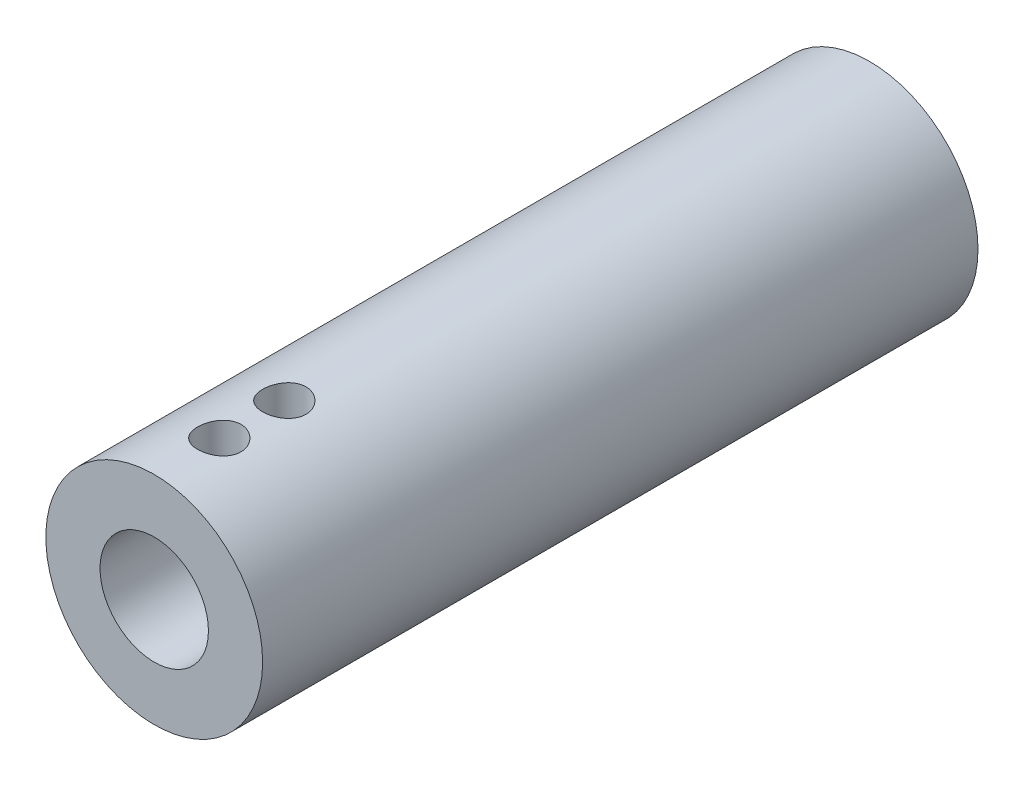
ISO-10303-21;
HEADER;
FILE_DESCRIPTION(('STEP AP214'),'2;1');
FILE_NAME('part.step','',(''),(''),'','','');
FILE_SCHEMA(('AUTOMOTIVE_DESIGN { 1 0 10303 214 1 1 1 1 }'));
ENDSEC;
DATA;
#1=APPLICATION_CONTEXT('core data for automotive mechanical design processes');
#2=APPLICATION_PROTOCOL_DEFINITION('international standard','automotive_design',2000,#1);
#3=PRODUCT_CONTEXT('',#1,'mechanical');
#4=PRODUCT('Part','Part','',(#3));
#5=PRODUCT_RELATED_PRODUCT_CATEGORY('part','',(#4));
#6=PRODUCT_DEFINITION_FORMATION('','',#4);
#7=PRODUCT_DEFINITION_CONTEXT('part definition',#1,'design');
#8=PRODUCT_DEFINITION('design','',#6,#7);
#9=PRODUCT_DEFINITION_SHAPE('','',#8);
#10=(LENGTH_UNIT() NAMED_UNIT(*) SI_UNIT(.MILLI.,.METRE.));
#11=(NAMED_UNIT(*) PLANE_ANGLE_UNIT() SI_UNIT($,.RADIAN.));
#12=(NAMED_UNIT(*) SI_UNIT($,.STERADIAN.) SOLID_ANGLE_UNIT());
#13=UNCERTAINTY_MEASURE_WITH_UNIT(LENGTH_MEASURE(1.E-05),#10,'distance_accuracy_value','');
#14=(GEOMETRIC_REPRESENTATION_CONTEXT(3) GLOBAL_UNCERTAINTY_ASSIGNED_CONTEXT((#13)) GLOBAL_UNIT_ASSIGNED_CONTEXT((#10,
#11,#12)) REPRESENTATION_CONTEXT('',''));
#15=CARTESIAN_POINT('',(0.,0.,0.));
#16=DIRECTION('',(0.,0.,1.));
#17=DIRECTION('',(1.,0.,0.));
#18=AXIS2_PLACEMENT_3D('',#15,#16,#17);
#19=CARTESIAN_POINT('',(0.,0.,33.));
#20=DIRECTION('',(0.,0.,-1.));
#21=DIRECTION('',(-1.,0.,0.));
#22=AXIS2_PLACEMENT_3D('',#19,#20,#21);
#23=CYLINDRICAL_SURFACE('',#22,5.);
#24=CARTESIAN_POINT('',(0.,0.,33.));
#25=DIRECTION('',(0.,0.,1.));
#26=DIRECTION('',(1.,0.,0.));
#27=AXIS2_PLACEMENT_3D('',#24,#25,#26);
#28=CIRCLE('',#27,5.);
#29=CARTESIAN_POINT('',(5.,0.,33.));
#30=VERTEX_POINT('',#29);
#31=EDGE_CURVE('E10',#30,#30,#28,.T.);
#32=ORIENTED_EDGE('',*,*,#31,.F.);
#33=EDGE_LOOP('',(#32));
#34=FACE_BOUND('',#33,.T.);
#35=CARTESIAN_POINT('',(0.,0.,0.));
#36=DIRECTION('',(0.,0.,1.));
#37=DIRECTION('',(1.,0.,0.));
#38=AXIS2_PLACEMENT_3D('',#35,#36,#37);
#39=CIRCLE('',#38,5.);
#40=CARTESIAN_POINT('',(5.,0.,0.));
#41=VERTEX_POINT('',#40);
#42=EDGE_CURVE('E51',#41,#41,#39,.T.);
#43=ORIENTED_EDGE('',*,*,#42,.T.);
#44=EDGE_LOOP('',(#43));
#45=FACE_BOUND('',#44,.T.);
#46=CARTESIAN_POINT('',(0.,5.,26.));
#47=CARTESIAN_POINT('',(-0.0555769067926259,4.99999897580871,26.0000020444983));
#48=CARTESIAN_POINT('',(-0.111179660201515,4.99906385178231,26.0046488429676));
#49=CARTESIAN_POINT('',(-0.220813507689012,4.99542365623231,26.0230985001152));
#50=CARTESIAN_POINT('',(-0.274843317541349,4.99271717860186,26.0369086328015));
#51=CARTESIAN_POINT('',(-0.379730305263306,4.98583649278287,26.0732412736208));
#52=CARTESIAN_POINT('',(-0.430590467933128,4.98166369076718,26.0957554368447));
#53=CARTESIAN_POINT('',(-0.527807988864219,4.97230398035314,26.1488322475113));
#54=CARTESIAN_POINT('',(-0.574165615075805,4.96711713235707,26.1793944156072));
#55=CARTESIAN_POINT('',(-0.661693477314859,4.9562216532997,26.2481384942914));
#56=CARTESIAN_POINT('',(-0.702793951158519,4.95050745504347,26.2864083553912));
#57=CARTESIAN_POINT('',(-0.778036756608022,4.93924180452588,26.3692924163917));
#58=CARTESIAN_POINT('',(-0.812178544770418,4.93369036500424,26.4139071113351));
#59=CARTESIAN_POINT('',(-0.872831753347614,4.92332441812615,26.5087161930119));
#60=CARTESIAN_POINT('',(-0.899270938865861,4.91851707364946,26.5589576437964));
#61=CARTESIAN_POINT('',(-0.943305666580302,4.91026268058418,26.6632818190041));
#62=CARTESIAN_POINT('',(-0.960902082437231,4.90681549761962,26.7173641633463));
#63=CARTESIAN_POINT('',(-0.98652529988482,4.90172805252205,26.8270843639079));
#64=CARTESIAN_POINT('',(-0.99467449795877,4.90006470107188,26.8826925441422));
#65=CARTESIAN_POINT('',(-1.00155212772611,4.89866375060627,26.9945098213643));
#66=CARTESIAN_POINT('',(-1.00028152271349,4.89892595467841,27.0507188563202));
#67=CARTESIAN_POINT('',(-0.988454573101811,4.90132551148185,27.161246788021));
#68=CARTESIAN_POINT('',(-0.978038540243898,4.90343452858764,27.2155814056273));
#69=CARTESIAN_POINT('',(-0.948437884623044,4.90924546160001,27.321716076663));
#70=CARTESIAN_POINT('',(-0.929252843100675,4.91294745357779,27.373516008919));
#71=CARTESIAN_POINT('',(-0.882524783674714,4.92155618500408,27.4735152617036));
#72=CARTESIAN_POINT('',(-0.854926151232108,4.92647089813705,27.5216878795692));
#73=CARTESIAN_POINT('',(-0.792193574572671,4.93694618773062,27.6127708499728));
#74=CARTESIAN_POINT('',(-0.75705876435682,4.94250683838366,27.6556805968512));
#75=CARTESIAN_POINT('',(-0.679499934560575,4.95377021241462,27.7358294024569));
#76=CARTESIAN_POINT('',(-0.636956161212436,4.95947369210905,27.7729525678591));
#77=CARTESIAN_POINT('',(-0.546185024062001,4.97028848714409,27.8395538463012));
#78=CARTESIAN_POINT('',(-0.497957587379379,4.97539979488974,27.8690318612936));
#79=CARTESIAN_POINT('',(-0.397059386878911,4.98446690160887,27.919527509226));
#80=CARTESIAN_POINT('',(-0.34438181958529,4.98842088848272,27.9405318936445));
#81=CARTESIAN_POINT('',(-0.236148976448656,4.99471408987858,27.9733604740386));
#82=CARTESIAN_POINT('',(-0.180594050072441,4.99705350000531,27.9851857820736));
#83=CARTESIAN_POINT('',(-0.0691794056271419,4.99982671866868,27.9991564537943));
#84=CARTESIAN_POINT('',(-0.0133403283255677,5.0002917465247,28.0014604195403));
#85=CARTESIAN_POINT('',(0.0979249341927224,4.99935051930103,27.9967501410578));
#86=CARTESIAN_POINT('',(0.153351142443801,4.99794436941446,27.9897364206474));
#87=CARTESIAN_POINT('',(0.261705659946549,4.99343832008018,27.966721626456));
#88=CARTESIAN_POINT('',(0.314651948339911,4.99035376404206,27.9508019315021));
#89=CARTESIAN_POINT('',(0.417123627499674,4.98283552061033,27.9105160173442));
#90=CARTESIAN_POINT('',(0.466648761637547,4.97840173214227,27.8861491653232));
#91=CARTESIAN_POINT('',(0.561541173686224,4.96859911533294,27.8293175093487));
#92=CARTESIAN_POINT('',(0.606850126752194,4.96321950437052,27.7967572189611));
#93=CARTESIAN_POINT('',(0.691418019119213,4.95214734829882,27.7245908087927));
#94=CARTESIAN_POINT('',(0.730676308930769,4.94645476968388,27.6849839336001));
#95=CARTESIAN_POINT('',(0.802640590774184,4.93529303556965,27.5991266481089));
#96=CARTESIAN_POINT('',(0.835237702448663,4.92982860233304,27.5527842557787));
#97=CARTESIAN_POINT('',(0.892185420051214,4.91984191796194,27.4551886386433));
#98=CARTESIAN_POINT('',(0.916536355922911,4.91531962913342,27.4039356104265));
#99=CARTESIAN_POINT('',(0.956151841581969,4.90776740584383,27.2982317538505));
#100=CARTESIAN_POINT('',(0.971463499791059,4.90472974872186,27.2437991587897));
#101=CARTESIAN_POINT('',(0.992708651627204,4.90047436792025,27.1330665465091));
#102=CARTESIAN_POINT('',(0.998643368225121,4.89925640691111,27.0767667737907));
#103=CARTESIAN_POINT('',(1.00092091086748,4.89879149631379,26.9649911354557));
#104=CARTESIAN_POINT('',(0.997435788070903,4.89950919189301,26.909518851073));
#105=CARTESIAN_POINT('',(0.981352304100067,4.90275573484614,26.799968350095));
#106=CARTESIAN_POINT('',(0.968754016129305,4.90528456767169,26.7458901223052));
#107=CARTESIAN_POINT('',(0.934878568498961,4.91185264219158,26.6407722887595));
#108=CARTESIAN_POINT('',(0.91362250671735,4.9158882101883,26.5897256394976));
#109=CARTESIAN_POINT('',(0.863054644601609,4.9250171497417,26.4918962792656));
#110=CARTESIAN_POINT('',(0.833742168774888,4.93011060998894,26.4451139262749));
#111=CARTESIAN_POINT('',(0.767305914786421,4.94088960523225,26.3562844278497));
#112=CARTESIAN_POINT('',(0.730057887235187,4.94658372909699,26.3143312347324));
#113=CARTESIAN_POINT('',(0.649064369013148,4.95786081871955,26.2372137944708));
#114=CARTESIAN_POINT('',(0.605317387153343,4.96344375863184,26.2020511096827));
#115=CARTESIAN_POINT('',(0.512017629088256,4.97393832387971,26.1391653560536));
#116=CARTESIAN_POINT('',(0.462408884429844,4.97884231219246,26.11152399672));
#117=CARTESIAN_POINT('',(0.35916636094074,4.98735125085,26.0650138774034));
#118=CARTESIAN_POINT('',(0.305536260863133,4.99095737138616,26.0461372104675));
#119=CARTESIAN_POINT('',(0.209821488923786,4.99576372595371,26.0213480519553));
#120=CARTESIAN_POINT('',(0.168281664013792,4.99734303158452,26.0133568062922));
#121=CARTESIAN_POINT('',(0.0844995252100748,4.99946154139893,26.0026820876416));
#122=CARTESIAN_POINT('',(0.0422572337486266,5.00000077873155,25.9999984454902));
#123=CARTESIAN_POINT('',(0.,5.,26.));
#124=B_SPLINE_CURVE_WITH_KNOTS('',3,(#46,#47,#48,#49,#50,#51,#52,#53,#54,#55,#56,#57,#58,#59,
#60,#61,#62,#63,#64,#65,#66,#67,#68,#69,#70,#71,#72,#73,#74,#75,#76,#77,#78,#79,#80,#81,#82,#83,
#84,#85,#86,#87,#88,#89,#90,#91,#92,#93,#94,#95,#96,#97,#98,#99,#100,#101,#102,#103,#104,#105,
#106,#107,#108,#109,#110,#111,#112,#113,#114,#115,#116,#117,#118,#119,#120,#121,#122,#123),
.UNSPECIFIED.,.T.,.F.,(4,2,2,2,2,2,2,2,2,2,2,2,2,2,2,2,2,2,2,2,2,2,2,2,2,2,2,2,2,2,2,2,2,2,2,2,
2,2,4),(0.,0.166576130661259,0.333284650691323,0.499833735250342,0.666372902230865,
0.834932670112188,1.00350559674737,1.17361195005923,1.34370149365198,1.51156185103587,
1.67940504281225,1.84471727006278,2.0100373925373,2.17647490203592,2.34293154749671,
2.51238252491351,2.68183567539821,2.85155274854024,3.02124925698036,3.18810735676265,
3.35495607657868,3.52030453950724,3.68566539216022,3.85305066033359,4.0204538834593,
4.19040628579226,4.36035188723467,4.52940381032724,4.69843368330415,4.86439722567702,
5.03035943492609,5.19591961253111,5.36149367581867,5.52988076239143,5.6983065453293,
5.86849496675637,6.03852955517519,6.16518775289894,6.29184191370996),.UNSPECIFIED.);
#125=CARTESIAN_POINT('',(0.,5.,26.));
#126=VERTEX_POINT('',#125);
#127=EDGE_CURVE('E69',#126,#126,#124,.T.);
#128=ORIENTED_EDGE('',*,*,#127,.F.);
#129=EDGE_LOOP('',(#128));
#130=FACE_BOUND('',#129,.T.);
#131=CARTESIAN_POINT('',(0.,5.,29.));
#132=CARTESIAN_POINT('',(-0.0555769067926252,4.99999897580871,29.0000020444983));
#133=CARTESIAN_POINT('',(-0.111179660201514,4.99906385178231,29.0046488429676));
#134=CARTESIAN_POINT('',(-0.220813507689011,4.99542365623231,29.0230985001152));
#135=CARTESIAN_POINT('',(-0.274843317541348,4.99271717860186,29.0369086328015));
#136=CARTESIAN_POINT('',(-0.379730305263306,4.98583649278287,29.0732412736208));
#137=CARTESIAN_POINT('',(-0.430590467933127,4.98166369076718,29.0957554368447));
#138=CARTESIAN_POINT('',(-0.527807988864219,4.97230398035314,29.1488322475113));
#139=CARTESIAN_POINT('',(-0.574165615075805,4.96711713235707,29.1793944156072));
#140=CARTESIAN_POINT('',(-0.661693477314858,4.9562216532997,29.2481384942914));
#141=CARTESIAN_POINT('',(-0.702793951158518,4.95050745504347,29.2864083553912));
#142=CARTESIAN_POINT('',(-0.778036756608021,4.93924180452588,29.3692924163917));
#143=CARTESIAN_POINT('',(-0.812178544770417,4.93369036500424,29.4139071113351));
#144=CARTESIAN_POINT('',(-0.872831753347613,4.92332441812615,29.5087161930119));
#145=CARTESIAN_POINT('',(-0.899270938865859,4.91851707364946,29.5589576437964));
#146=CARTESIAN_POINT('',(-0.9433056665803,4.91026268058418,29.6632818190041));
#147=CARTESIAN_POINT('',(-0.96090208243723,4.90681549761962,29.7173641633463));
#148=CARTESIAN_POINT('',(-0.98652529988482,4.90172805252205,29.8270843639079));
#149=CARTESIAN_POINT('',(-0.99467449795877,4.90006470107188,29.8826925441422));
#150=CARTESIAN_POINT('',(-1.00155212772611,4.89866375060627,29.9945098213643));
#151=CARTESIAN_POINT('',(-1.00028152271349,4.89892595467841,30.0507188563202));
#152=CARTESIAN_POINT('',(-0.988454573101811,4.90132551148185,30.161246788021));
#153=CARTESIAN_POINT('',(-0.978038540243898,4.90343452858764,30.2155814056273));
#154=CARTESIAN_POINT('',(-0.948437884623043,4.90924546160001,30.321716076663));
#155=CARTESIAN_POINT('',(-0.929252843100674,4.91294745357779,30.373516008919));
#156=CARTESIAN_POINT('',(-0.882524783674713,4.92155618500408,30.4735152617036));
#157=CARTESIAN_POINT('',(-0.854926151232109,4.92647089813704,30.5216878795692));
#158=CARTESIAN_POINT('',(-0.792193574572672,4.93694618773062,30.6127708499728));
#159=CARTESIAN_POINT('',(-0.75705876435682,4.94250683838366,30.6556805968512));
#160=CARTESIAN_POINT('',(-0.679499934560574,4.95377021241462,30.7358294024569));
#161=CARTESIAN_POINT('',(-0.636956161212434,4.95947369210905,30.7729525678591));
#162=CARTESIAN_POINT('',(-0.546185024062,4.97028848714409,30.8395538463012));
#163=CARTESIAN_POINT('',(-0.497957587379378,4.97539979488974,30.8690318612936));
#164=CARTESIAN_POINT('',(-0.39705938687891,4.98446690160887,30.919527509226));
#165=CARTESIAN_POINT('',(-0.34438181958529,4.98842088848272,30.9405318936445));
#166=CARTESIAN_POINT('',(-0.236148976448656,4.99471408987858,30.9733604740386));
#167=CARTESIAN_POINT('',(-0.18059405007244,4.99705350000531,30.9851857820736));
#168=CARTESIAN_POINT('',(-0.0691794056271416,4.99982671866868,30.9991564537943));
#169=CARTESIAN_POINT('',(-0.0133403283255674,5.0002917465247,31.0014604195403));
#170=CARTESIAN_POINT('',(0.0979249341927227,4.99935051930103,30.9967501410578));
#171=CARTESIAN_POINT('',(0.153351142443802,4.99794436941446,30.9897364206474));
#172=CARTESIAN_POINT('',(0.261705659946549,4.99343832008018,30.966721626456));
#173=CARTESIAN_POINT('',(0.314651948339911,4.99035376404206,30.9508019315021));
#174=CARTESIAN_POINT('',(0.417123627499675,4.98283552061033,30.9105160173442));
#175=CARTESIAN_POINT('',(0.466648761637547,4.97840173214227,30.8861491653232));
#176=CARTESIAN_POINT('',(0.561541173686225,4.96859911533294,30.8293175093487));
#177=CARTESIAN_POINT('',(0.606850126752196,4.96321950437052,30.7967572189611));
#178=CARTESIAN_POINT('',(0.691418019119215,4.95214734829882,30.7245908087927));
#179=CARTESIAN_POINT('',(0.73067630893077,4.94645476968388,30.6849839336001));
#180=CARTESIAN_POINT('',(0.802640590774185,4.93529303556965,30.5991266481089));
#181=CARTESIAN_POINT('',(0.835237702448665,4.92982860233304,30.5527842557787));
#182=CARTESIAN_POINT('',(0.892185420051215,4.91984191796194,30.4551886386433));
#183=CARTESIAN_POINT('',(0.916536355922912,4.91531962913342,30.4039356104264));
#184=CARTESIAN_POINT('',(0.956151841581969,4.90776740584383,30.2982317538504));
#185=CARTESIAN_POINT('',(0.971463499791059,4.90472974872186,30.2437991587897));
#186=CARTESIAN_POINT('',(0.992708651627205,4.90047436792025,30.1330665465091));
#187=CARTESIAN_POINT('',(0.998643368225121,4.89925640691111,30.0767667737907));
#188=CARTESIAN_POINT('',(1.00092091086748,4.89879149631379,29.9649911354557));
#189=CARTESIAN_POINT('',(0.997435788070904,4.89950919189301,29.909518851073));
#190=CARTESIAN_POINT('',(0.981352304100069,4.90275573484614,29.799968350095));
#191=CARTESIAN_POINT('',(0.968754016129306,4.90528456767169,29.7458901223052));
#192=CARTESIAN_POINT('',(0.934878568498961,4.91185264219158,29.6407722887595));
#193=CARTESIAN_POINT('',(0.913622506717351,4.9158882101883,29.5897256394976));
#194=CARTESIAN_POINT('',(0.863054644601611,4.9250171497417,29.4918962792656));
#195=CARTESIAN_POINT('',(0.833742168774889,4.93011060998894,29.4451139262749));
#196=CARTESIAN_POINT('',(0.767305914786421,4.94088960523225,29.3562844278497));
#197=CARTESIAN_POINT('',(0.730057887235186,4.94658372909699,29.3143312347324));
#198=CARTESIAN_POINT('',(0.649064369013147,4.95786081871955,29.2372137944708));
#199=CARTESIAN_POINT('',(0.605317387153343,4.96344375863184,29.2020511096827));
#200=CARTESIAN_POINT('',(0.512017629088256,4.97393832387971,29.1391653560536));
#201=CARTESIAN_POINT('',(0.462408884429844,4.97884231219246,29.11152399672));
#202=CARTESIAN_POINT('',(0.359166360940741,4.98735125085,29.0650138774034));
#203=CARTESIAN_POINT('',(0.305536260863134,4.99095737138616,29.0461372104675));
#204=CARTESIAN_POINT('',(0.209821488923786,4.99576372595371,29.0213480519553));
#205=CARTESIAN_POINT('',(0.168281664013792,4.99734303158452,29.0133568062922));
#206=CARTESIAN_POINT('',(0.0844995252100748,4.99946154139893,29.0026820876416));
#207=CARTESIAN_POINT('',(0.0422572337486269,5.00000077873155,28.9999984454902));
#208=CARTESIAN_POINT('',(0.,5.,29.));
#209=B_SPLINE_CURVE_WITH_KNOTS('',3,(#131,#132,#133,#134,#135,#136,#137,#138,#139,#140,#141,
#142,#143,#144,#145,#146,#147,#148,#149,#150,#151,#152,#153,#154,#155,#156,#157,#158,#159,#160,
#161,#162,#163,#164,#165,#166,#167,#168,#169,#170,#171,#172,#173,#174,#175,#176,#177,#178,#179,
#180,#181,#182,#183,#184,#185,#186,#187,#188,#189,#190,#191,#192,#193,#194,#195,#196,#197,#198,
#199,#200,#201,#202,#203,#204,#205,#206,#207,#208),.UNSPECIFIED.,.T.,.F.,(4,2,2,2,2,2,2,2,2,2,2,
2,2,2,2,2,2,2,2,2,2,2,2,2,2,2,2,2,2,2,2,2,2,2,2,2,2,2,4),(0.,0.166576130661258,
0.333284650691324,0.499833735250343,0.666372902230865,0.834932670112189,1.00350559674737,
1.17361195005923,1.34370149365198,1.51156185103587,1.67940504281225,1.84471727006278,
2.0100373925373,2.17647490203592,2.34293154749671,2.51238252491351,2.68183567539821,
2.85155274854024,3.02124925698036,3.18810735676265,3.35495607657868,3.52030453950724,
3.68566539216023,3.85305066033359,4.0204538834593,4.19040628579226,4.36035188723467,
4.52940381032724,4.69843368330415,4.86439722567702,5.03035943492609,5.1959196125311,
5.36149367581867,5.52988076239144,5.69830654532931,5.86849496675637,6.03852955517519,
6.16518775289895,6.29184191370997),.UNSPECIFIED.);
#210=CARTESIAN_POINT('',(0.,5.,29.));
#211=VERTEX_POINT('',#210);
#212=EDGE_CURVE('E91',#211,#211,#209,.T.);
#213=ORIENTED_EDGE('',*,*,#212,.F.);
#214=EDGE_LOOP('',(#213));
#215=FACE_BOUND('',#214,.T.);
#216=ADVANCED_FACE('F37',(#34,#45,#130,#215),#23,.T.);
#217=CARTESIAN_POINT('',(0.,0.,18.));
#218=DIRECTION('',(0.,0.,1.));
#219=DIRECTION('',(1.,0.,0.));
#220=AXIS2_PLACEMENT_3D('',#217,#218,#219);
#221=CYLINDRICAL_SURFACE('',#220,2.5);
#222=CARTESIAN_POINT('',(0.,0.,18.));
#223=DIRECTION('',(0.,0.,1.));
#224=DIRECTION('',(1.,0.,0.));
#225=AXIS2_PLACEMENT_3D('',#222,#223,#224);
#226=CIRCLE('',#225,2.5);
#227=CARTESIAN_POINT('',(2.5,0.,18.));
#228=VERTEX_POINT('',#227);
#229=EDGE_CURVE('E57',#228,#228,#226,.T.);
#230=ORIENTED_EDGE('',*,*,#229,.F.);
#231=EDGE_LOOP('',(#230));
#232=FACE_BOUND('',#231,.T.);
#233=CARTESIAN_POINT('',(0.,0.,33.));
#234=DIRECTION('',(0.,0.,1.));
#235=DIRECTION('',(1.,0.,0.));
#236=AXIS2_PLACEMENT_3D('',#233,#234,#235);
#237=CIRCLE('',#236,2.5);
#238=CARTESIAN_POINT('',(2.5,0.,33.));
#239=VERTEX_POINT('',#238);
#240=EDGE_CURVE('E60',#239,#239,#237,.T.);
#241=ORIENTED_EDGE('',*,*,#240,.T.);
#242=EDGE_LOOP('',(#241));
#243=FACE_BOUND('',#242,.T.);
#244=CARTESIAN_POINT('',(0.,2.5,26.));
#245=CARTESIAN_POINT('',(0.053746502721453,2.49999635613542,26.0000049259119));
#246=CARTESIAN_POINT('',(0.107586282045344,2.49824647153466,26.0043588760442));
#247=CARTESIAN_POINT('',(0.213748240208955,2.49141726550321,26.0216238517606));
#248=CARTESIAN_POINT('',(0.266065888780632,2.48632889349439,26.0345581395431));
#249=CARTESIAN_POINT('',(0.367476961363709,2.47337104606559,26.0684380390294));
#250=CARTESIAN_POINT('',(0.416580330808487,2.46551068182036,26.0893574231084));
#251=CARTESIAN_POINT('',(0.510535985164191,2.44778305398039,26.1385095866633));
#252=CARTESIAN_POINT('',(0.555389738375503,2.43791648729028,26.1667398274595));
#253=CARTESIAN_POINT('',(0.641750503785203,2.41665443085209,26.2311177492805));
#254=CARTESIAN_POINT('',(0.683031136275114,2.40521148464595,26.2675533281201));
#255=CARTESIAN_POINT('',(0.759087502392369,2.38230288453097,26.3467000017384));
#256=CARTESIAN_POINT('',(0.793860053566774,2.37083722226896,26.3894141486059));
#257=CARTESIAN_POINT('',(0.857437283646447,2.34861395898568,26.4822140351211));
#258=CARTESIAN_POINT('',(0.885907490597744,2.33791057982475,26.5325432430116));
#259=CARTESIAN_POINT('',(0.933877359518582,2.31916823593396,26.63776819921));
#260=CARTESIAN_POINT('',(0.953381282142925,2.31112800622088,26.6926617639242));
#261=CARTESIAN_POINT('',(0.981949411697941,2.29913178830409,26.8028561667961));
#262=CARTESIAN_POINT('',(0.991446982902831,2.29500710177802,26.8580256177881));
#263=CARTESIAN_POINT('',(1.00108648082002,2.29082002024572,26.9693174991536));
#264=CARTESIAN_POINT('',(1.00123300815662,2.29075562761384,27.0254394473125));
#265=CARTESIAN_POINT('',(0.99249468375228,2.29455250139997,27.132878335729));
#266=CARTESIAN_POINT('',(0.984237657152576,2.29814087519225,27.1842578572045));
#267=CARTESIAN_POINT('',(0.959973440148917,2.30838093803918,27.2848297780034));
#268=CARTESIAN_POINT('',(0.943964897402323,2.31503316160836,27.3340217940552));
#269=CARTESIAN_POINT('',(0.904347366275544,2.33079742544265,27.430008918098));
#270=CARTESIAN_POINT('',(0.880589931157665,2.33995689640394,27.4767346195274));
#271=CARTESIAN_POINT('',(0.826253230366113,2.35969058194945,27.5657079081808));
#272=CARTESIAN_POINT('',(0.795671402550429,2.37026532728424,27.6079538047014));
#273=CARTESIAN_POINT('',(0.725775299727224,2.39263368371135,27.690204864401));
#274=CARTESIAN_POINT('',(0.685968731485323,2.40445832488076,27.729784364723));
#275=CARTESIAN_POINT('',(0.600157213715101,2.42729912479141,27.801842239001));
#276=CARTESIAN_POINT('',(0.554151032667223,2.43831512222662,27.8343191987052));
#277=CARTESIAN_POINT('',(0.456038826302928,2.45857340632274,27.8918087237079));
#278=CARTESIAN_POINT('',(0.403830245673245,2.46777635047707,27.9166611405985));
#279=CARTESIAN_POINT('',(0.295511882741447,2.48307414164379,27.957083930539));
#280=CARTESIAN_POINT('',(0.239404098424844,2.48917056731191,27.9726590187787));
#281=CARTESIAN_POINT('',(0.128447943803917,2.49728069753455,27.9932241477099));
#282=CARTESIAN_POINT('',(0.0737216469927748,2.49951472916757,27.9987862271268));
#283=CARTESIAN_POINT('',(-0.0359226549039006,2.50034239255315,28.0008565502643));
#284=CARTESIAN_POINT('',(-0.0908406066119537,2.49893696791146,27.9973671407738));
#285=CARTESIAN_POINT('',(-0.196716369560986,2.49278783531877,27.981854123724));
#286=CARTESIAN_POINT('',(-0.247741245887729,2.48819695672762,27.9702210098245));
#287=CARTESIAN_POINT('',(-0.347067714030382,2.4762972070275,27.9392821458451));
#288=CARTESIAN_POINT('',(-0.395368955112415,2.46898798678265,27.9199754101657));
#289=CARTESIAN_POINT('',(-0.489539392908343,2.45208297385406,27.87360753016));
#290=CARTESIAN_POINT('',(-0.535289011377695,2.44242407989902,27.8463272639784));
#291=CARTESIAN_POINT('',(-0.621721795623269,2.42186682372763,27.7850298380472));
#292=CARTESIAN_POINT('',(-0.662402920380554,2.41096796555135,27.7510099785387));
#293=CARTESIAN_POINT('',(-0.740361521514402,2.38822558819056,27.6745649935252));
#294=CARTESIAN_POINT('',(-0.777236966903025,2.37636720712526,27.6317332292469));
#295=CARTESIAN_POINT('',(-0.843375598706848,2.35370836458566,27.5402799584953));
#296=CARTESIAN_POINT('',(-0.872637530668747,2.34290807763256,27.49165749983));
#297=CARTESIAN_POINT('',(-0.922903750965805,2.32357149953855,27.389269152703));
#298=CARTESIAN_POINT('',(-0.943825297267218,2.31505815442394,27.3354580003939));
#299=CARTESIAN_POINT('',(-0.976148109852644,2.30161836738966,27.2246331741424));
#300=CARTESIAN_POINT('',(-0.98755640263465,2.29668927847999,27.1676218970938));
#301=CARTESIAN_POINT('',(-0.999857808639194,2.29135879649963,27.0564360491127));
#302=CARTESIAN_POINT('',(-1.00144854115143,2.29065710504086,27.0023525802033));
#303=CARTESIAN_POINT('',(-0.995901579638755,2.29307418016549,26.8947275711434));
#304=CARTESIAN_POINT('',(-0.988764993956884,2.29619246162397,26.8411859630487));
#305=CARTESIAN_POINT('',(-0.966535683076817,2.30563324539511,26.7383339050725));
#306=CARTESIAN_POINT('',(-0.951768746785482,2.31182415913725,26.6889398627835));
#307=CARTESIAN_POINT('',(-0.915002724245499,2.32662000616349,26.5933106851933));
#308=CARTESIAN_POINT('',(-0.893001640696899,2.33522560603004,26.5470764265501));
#309=CARTESIAN_POINT('',(-0.840936381379857,2.35449304802246,26.4561951903646));
#310=CARTESIAN_POINT('',(-0.810482667579738,2.36524441156621,26.4117906649348));
#311=CARTESIAN_POINT('',(-0.742946059635741,2.38731902186119,26.3285033413981));
#312=CARTESIAN_POINT('',(-0.705861167409054,2.39864244024203,26.2896222139358));
#313=CARTESIAN_POINT('',(-0.623252753136224,2.42146783543697,26.2158985733682));
#314=CARTESIAN_POINT('',(-0.577338000573062,2.43293378981093,26.181481346551));
#315=CARTESIAN_POINT('',(-0.479950160142882,2.45400203356859,26.1208314786892));
#316=CARTESIAN_POINT('',(-0.428474502273611,2.46360345546453,26.0946026439237));
#317=CARTESIAN_POINT('',(-0.322369031247594,2.47969857407931,26.0516888924049));
#318=CARTESIAN_POINT('',(-0.267815809109841,2.48624681527514,26.0348353382198));
#319=CARTESIAN_POINT('',(-0.156438273140603,2.49572153104683,26.0106804395229));
#320=CARTESIAN_POINT('',(-0.0996217629294482,2.49865949747819,26.0033487816281));
#321=CARTESIAN_POINT('',(-0.0284561489454569,2.49987949752068,26.0003023095109));
#322=CARTESIAN_POINT('',(-0.0142313443703716,2.50000096484588,25.9999986956854));
#323=CARTESIAN_POINT('',(0.,2.5,26.));
#324=B_SPLINE_CURVE_WITH_KNOTS('',3,(#244,#245,#246,#247,#248,#249,#250,#251,#252,#253,#254,
#255,#256,#257,#258,#259,#260,#261,#262,#263,#264,#265,#266,#267,#268,#269,#270,#271,#272,#273,
#274,#275,#276,#277,#278,#279,#280,#281,#282,#283,#284,#285,#286,#287,#288,#289,#290,#291,#292,
#293,#294,#295,#296,#297,#298,#299,#300,#301,#302,#303,#304,#305,#306,#307,#308,#309,#310,#311,
#312,#313,#314,#315,#316,#317,#318,#319,#320,#321,#322,#323),.UNSPECIFIED.,.T.,.F.,(4,2,2,2,2,2,
2,2,2,2,2,2,2,2,2,2,2,2,2,2,2,2,2,2,2,2,2,2,2,2,2,2,2,2,2,2,2,2,2,4),(0.,0.161201493946536,
0.322841818003967,0.48395572873579,0.645013767839922,0.812986908501986,0.981041974672059,
1.15657629409609,1.33202711559134,1.49952052654414,1.66693153170244,1.82269164200686,
1.97847893628024,2.13744563149409,2.29647210969092,2.46779174593279,2.63914546419867,
2.81388456581404,2.98853478056895,3.15284592264004,3.31711446785041,3.47400227782183,
3.63091024496898,3.79261756699131,3.95438979749485,4.12684237312207,4.29932334521874,
4.47347522570414,4.64749836322967,4.80899836696374,4.97047786281523,5.12557159274385,
5.28070817902581,5.44472734028346,5.60879600674197,5.78350211766918,5.95828931820267,
6.1298215050666,6.30080626202171,6.34349022948398),.UNSPECIFIED.);
#325=CARTESIAN_POINT('',(0.,2.5,26.));
#326=VERTEX_POINT('',#325);
#327=EDGE_CURVE('E62',#326,#326,#324,.T.);
#328=ORIENTED_EDGE('',*,*,#327,.F.);
#329=EDGE_LOOP('',(#328));
#330=FACE_BOUND('',#329,.T.);
#331=CARTESIAN_POINT('',(0.,2.5,29.));
#332=CARTESIAN_POINT('',(0.0537465027214532,2.49999635613542,29.0000049259119));
#333=CARTESIAN_POINT('',(0.107586282045344,2.49824647153466,29.0043588760442));
#334=CARTESIAN_POINT('',(0.213748240208955,2.49141726550321,29.0216238517606));
#335=CARTESIAN_POINT('',(0.266065888780632,2.48632889349439,29.0345581395431));
#336=CARTESIAN_POINT('',(0.367476961363709,2.47337104606559,29.0684380390294));
#337=CARTESIAN_POINT('',(0.416580330808486,2.46551068182036,29.0893574231084));
#338=CARTESIAN_POINT('',(0.51053598516419,2.44778305398039,29.1385095866633));
#339=CARTESIAN_POINT('',(0.555389738375503,2.43791648729028,29.1667398274595));
#340=CARTESIAN_POINT('',(0.641750503785204,2.41665443085209,29.2311177492805));
#341=CARTESIAN_POINT('',(0.683031136275116,2.40521148464595,29.2675533281201));
#342=CARTESIAN_POINT('',(0.759087502392371,2.38230288453097,29.3467000017384));
#343=CARTESIAN_POINT('',(0.793860053566775,2.37083722226896,29.3894141486059));
#344=CARTESIAN_POINT('',(0.857437283646447,2.34861395898568,29.4822140351211));
#345=CARTESIAN_POINT('',(0.885907490597744,2.33791057982475,29.5325432430116));
#346=CARTESIAN_POINT('',(0.933877359518582,2.31916823593396,29.63776819921));
#347=CARTESIAN_POINT('',(0.953381282142925,2.31112800622088,29.6926617639242));
#348=CARTESIAN_POINT('',(0.981949411697942,2.29913178830409,29.8028561667961));
#349=CARTESIAN_POINT('',(0.991446982902832,2.29500710177802,29.8580256177881));
#350=CARTESIAN_POINT('',(1.00108648082002,2.29082002024572,29.9693174991536));
#351=CARTESIAN_POINT('',(1.00123300815662,2.29075562761384,30.0254394473125));
#352=CARTESIAN_POINT('',(0.99249468375228,2.29455250139997,30.132878335729));
#353=CARTESIAN_POINT('',(0.984237657152576,2.29814087519225,30.1842578572045));
#354=CARTESIAN_POINT('',(0.959973440148918,2.30838093803918,30.2848297780034));
#355=CARTESIAN_POINT('',(0.943964897402324,2.31503316160836,30.3340217940552));
#356=CARTESIAN_POINT('',(0.904347366275544,2.33079742544265,30.430008918098));
#357=CARTESIAN_POINT('',(0.880589931157666,2.33995689640394,30.4767346195273));
#358=CARTESIAN_POINT('',(0.826253230366114,2.35969058194945,30.5657079081808));
#359=CARTESIAN_POINT('',(0.79567140255043,2.37026532728424,30.6079538047014));
#360=CARTESIAN_POINT('',(0.725775299727224,2.39263368371135,30.690204864401));
#361=CARTESIAN_POINT('',(0.685968731485323,2.40445832488076,30.729784364723));
#362=CARTESIAN_POINT('',(0.600157213715102,2.42729912479141,30.801842239001));
#363=CARTESIAN_POINT('',(0.554151032667224,2.43831512222662,30.8343191987052));
#364=CARTESIAN_POINT('',(0.456038826302929,2.45857340632274,30.8918087237079));
#365=CARTESIAN_POINT('',(0.403830245673246,2.46777635047707,30.9166611405985));
#366=CARTESIAN_POINT('',(0.295511882741448,2.48307414164379,30.957083930539));
#367=CARTESIAN_POINT('',(0.239404098424844,2.48917056731191,30.9726590187787));
#368=CARTESIAN_POINT('',(0.128447943803918,2.49728069753455,30.9932241477099));
#369=CARTESIAN_POINT('',(0.0737216469927753,2.49951472916757,30.9987862271268));
#370=CARTESIAN_POINT('',(-0.0359226549039003,2.50034239255315,31.0008565502643));
#371=CARTESIAN_POINT('',(-0.0908406066119534,2.49893696791146,30.9973671407738));
#372=CARTESIAN_POINT('',(-0.196716369560985,2.49278783531877,30.981854123724));
#373=CARTESIAN_POINT('',(-0.247741245887728,2.48819695672762,30.9702210098245));
#374=CARTESIAN_POINT('',(-0.347067714030382,2.4762972070275,30.9392821458451));
#375=CARTESIAN_POINT('',(-0.395368955112414,2.46898798678265,30.9199754101657));
#376=CARTESIAN_POINT('',(-0.489539392908342,2.45208297385406,30.87360753016));
#377=CARTESIAN_POINT('',(-0.535289011377693,2.44242407989902,30.8463272639784));
#378=CARTESIAN_POINT('',(-0.621721795623268,2.42186682372763,30.7850298380472));
#379=CARTESIAN_POINT('',(-0.662402920380553,2.41096796555135,30.7510099785387));
#380=CARTESIAN_POINT('',(-0.7403615215144,2.38822558819056,30.6745649935252));
#381=CARTESIAN_POINT('',(-0.777236966903023,2.37636720712526,30.6317332292469));
#382=CARTESIAN_POINT('',(-0.843375598706847,2.35370836458566,30.5402799584953));
#383=CARTESIAN_POINT('',(-0.872637530668746,2.34290807763256,30.49165749983));
#384=CARTESIAN_POINT('',(-0.922903750965806,2.32357149953855,30.3892691527029));
#385=CARTESIAN_POINT('',(-0.943825297267219,2.31505815442394,30.3354580003938));
#386=CARTESIAN_POINT('',(-0.976148109852645,2.30161836738966,30.2246331741424));
#387=CARTESIAN_POINT('',(-0.98755640263465,2.29668927847999,30.1676218970938));
#388=CARTESIAN_POINT('',(-0.999857808639194,2.29135879649963,30.0564360491127));
#389=CARTESIAN_POINT('',(-1.00144854115143,2.29065710504086,30.0023525802033));
#390=CARTESIAN_POINT('',(-0.995901579638754,2.29307418016549,29.8947275711434));
#391=CARTESIAN_POINT('',(-0.988764993956883,2.29619246162397,29.8411859630487));
#392=CARTESIAN_POINT('',(-0.966535683076816,2.30563324539511,29.7383339050725));
#393=CARTESIAN_POINT('',(-0.95176874678548,2.31182415913725,29.6889398627835));
#394=CARTESIAN_POINT('',(-0.915002724245498,2.32662000616349,29.5933106851933));
#395=CARTESIAN_POINT('',(-0.893001640696898,2.33522560603004,29.5470764265501));
#396=CARTESIAN_POINT('',(-0.840936381379856,2.35449304802246,29.4561951903646));
#397=CARTESIAN_POINT('',(-0.810482667579736,2.36524441156621,29.4117906649348));
#398=CARTESIAN_POINT('',(-0.742946059635739,2.38731902186119,29.3285033413981));
#399=CARTESIAN_POINT('',(-0.705861167409053,2.39864244024203,29.2896222139358));
#400=CARTESIAN_POINT('',(-0.623252753136224,2.42146783543697,29.2158985733682));
#401=CARTESIAN_POINT('',(-0.577338000573061,2.43293378981093,29.181481346551));
#402=CARTESIAN_POINT('',(-0.479950160142881,2.45400203356859,29.1208314786892));
#403=CARTESIAN_POINT('',(-0.42847450227361,2.46360345546453,29.0946026439237));
#404=CARTESIAN_POINT('',(-0.322369031247594,2.47969857407931,29.0516888924049));
#405=CARTESIAN_POINT('',(-0.26781580910984,2.48624681527514,29.0348353382198));
#406=CARTESIAN_POINT('',(-0.156438273140602,2.49572153104683,29.0106804395229));
#407=CARTESIAN_POINT('',(-0.0996217629294478,2.49865949747819,29.0033487816281));
#408=CARTESIAN_POINT('',(-0.0284561489454564,2.49987949752068,29.0003023095109));
#409=CARTESIAN_POINT('',(-0.014231344370371,2.50000096484588,28.9999986956854));
#410=CARTESIAN_POINT('',(0.,2.5,29.));
#411=B_SPLINE_CURVE_WITH_KNOTS('',3,(#331,#332,#333,#334,#335,#336,#337,#338,#339,#340,#341,
#342,#343,#344,#345,#346,#347,#348,#349,#350,#351,#352,#353,#354,#355,#356,#357,#358,#359,#360,
#361,#362,#363,#364,#365,#366,#367,#368,#369,#370,#371,#372,#373,#374,#375,#376,#377,#378,#379,
#380,#381,#382,#383,#384,#385,#386,#387,#388,#389,#390,#391,#392,#393,#394,#395,#396,#397,#398,
#399,#400,#401,#402,#403,#404,#405,#406,#407,#408,#409,#410),.UNSPECIFIED.,.T.,.F.,(4,2,2,2,2,2,
2,2,2,2,2,2,2,2,2,2,2,2,2,2,2,2,2,2,2,2,2,2,2,2,2,2,2,2,2,2,2,2,2,4),(0.,0.161201493946535,
0.322841818003967,0.483955728735789,0.645013767839922,0.812986908501987,0.981041974672059,
1.15657629409608,1.33202711559134,1.49952052654414,1.66693153170244,1.82269164200686,
1.97847893628024,2.13744563149408,2.29647210969092,2.46779174593279,2.63914546419867,
2.81388456581403,2.98853478056895,3.15284592264004,3.31711446785041,3.47400227782183,
3.63091024496898,3.79261756699131,3.95438979749484,4.12684237312207,4.29932334521874,
4.47347522570414,4.64749836322967,4.80899836696374,4.97047786281523,5.12557159274385,
5.28070817902581,5.44472734028346,5.60879600674197,5.78350211766918,5.95828931820267,
6.1298215050666,6.30080626202171,6.34349022948398),.UNSPECIFIED.);
#412=CARTESIAN_POINT('',(0.,2.5,29.));
#413=VERTEX_POINT('',#412);
#414=EDGE_CURVE('E41',#413,#413,#411,.T.);
#415=ORIENTED_EDGE('',*,*,#414,.F.);
#416=EDGE_LOOP('',(#415));
#417=FACE_BOUND('',#416,.T.);
#418=ADVANCED_FACE('F70',(#232,#243,#330,#417),#221,.F.);
#419=CARTESIAN_POINT('',(0.,0.,33.));
#420=DIRECTION('',(0.,0.,1.));
#421=DIRECTION('',(1.,0.,0.));
#422=AXIS2_PLACEMENT_3D('',#419,#420,#421);
#423=PLANE('',#422);
#424=ORIENTED_EDGE('',*,*,#240,.F.);
#425=EDGE_LOOP('',(#424));
#426=FACE_BOUND('',#425,.T.);
#427=ORIENTED_EDGE('',*,*,#31,.T.);
#428=EDGE_LOOP('',(#427));
#429=FACE_BOUND('',#428,.T.);
#430=ADVANCED_FACE('F115',(#426,#429),#423,.T.);
#431=CARTESIAN_POINT('',(0.,0.,0.));
#432=DIRECTION('',(0.,0.,1.));
#433=DIRECTION('',(1.,0.,0.));
#434=AXIS2_PLACEMENT_3D('',#431,#432,#433);
#435=PLANE('',#434);
#436=CARTESIAN_POINT('',(0.,0.,0.));
#437=DIRECTION('',(0.,0.,-1.));
#438=DIRECTION('',(-1.,0.,0.));
#439=AXIS2_PLACEMENT_3D('',#436,#437,#438);
#440=CIRCLE('',#439,1.5);
#441=CARTESIAN_POINT('',(-1.5,0.,0.));
#442=VERTEX_POINT('',#441);
#443=EDGE_CURVE('E98',#442,#442,#440,.T.);
#444=ORIENTED_EDGE('',*,*,#443,.F.);
#445=EDGE_LOOP('',(#444));
#446=FACE_BOUND('',#445,.T.);
#447=ORIENTED_EDGE('',*,*,#42,.F.);
#448=EDGE_LOOP('',(#447));
#449=FACE_BOUND('',#448,.T.);
#450=ADVANCED_FACE('F117',(#446,#449),#435,.F.);
#451=CARTESIAN_POINT('',(0.,0.,18.));
#452=DIRECTION('',(0.,0.,1.));
#453=DIRECTION('',(1.,0.,0.));
#454=AXIS2_PLACEMENT_3D('',#451,#452,#453);
#455=PLANE('',#454);
#456=ORIENTED_EDGE('',*,*,#229,.T.);
#457=EDGE_LOOP('',(#456));
#458=FACE_BOUND('',#457,.T.);
#459=ADVANCED_FACE('F122',(#458),#455,.T.);
#460=CARTESIAN_POINT('',(0.,0.,10.));
#461=DIRECTION('',(0.,0.,-1.));
#462=DIRECTION('',(-1.,0.,0.));
#463=AXIS2_PLACEMENT_3D('',#460,#461,#462);
#464=CYLINDRICAL_SURFACE('',#463,1.5);
#465=CARTESIAN_POINT('',(0.,0.,10.));
#466=DIRECTION('',(0.,0.,-1.));
#467=DIRECTION('',(-1.,0.,0.));
#468=AXIS2_PLACEMENT_3D('',#465,#466,#467);
#469=CIRCLE('',#468,1.5);
#470=CARTESIAN_POINT('',(-1.5,0.,10.));
#471=VERTEX_POINT('',#470);
#472=EDGE_CURVE('E99',#471,#471,#469,.T.);
#473=ORIENTED_EDGE('',*,*,#472,.F.);
#474=EDGE_LOOP('',(#473));
#475=FACE_BOUND('',#474,.T.);
#476=ORIENTED_EDGE('',*,*,#443,.T.);
#477=EDGE_LOOP('',(#476));
#478=FACE_BOUND('',#477,.T.);
#479=ADVANCED_FACE('F155',(#475,#478),#464,.F.);
#480=CARTESIAN_POINT('',(0.,0.,10.));
#481=DIRECTION('',(0.,0.,-1.));
#482=DIRECTION('',(-1.,0.,0.));
#483=AXIS2_PLACEMENT_3D('',#480,#481,#482);
#484=PLANE('',#483);
#485=ORIENTED_EDGE('',*,*,#472,.T.);
#486=EDGE_LOOP('',(#485));
#487=FACE_BOUND('',#486,.T.);
#488=ADVANCED_FACE('F79',(#487),#484,.T.);
#489=CARTESIAN_POINT('',(0.,10.,27.));
#490=DIRECTION('',(0.,-1.,0.));
#491=DIRECTION('',(0.,0.,-1.));
#492=AXIS2_PLACEMENT_3D('',#489,#490,#491);
#493=CYLINDRICAL_SURFACE('',#492,1.);
#494=ORIENTED_EDGE('',*,*,#327,.T.);
#495=EDGE_LOOP('',(#494));
#496=FACE_BOUND('',#495,.T.);
#497=ORIENTED_EDGE('',*,*,#127,.T.);
#498=EDGE_LOOP('',(#497));
#499=FACE_BOUND('',#498,.T.);
#500=ADVANCED_FACE('F74',(#496,#499),#493,.F.);
#501=CARTESIAN_POINT('',(0.,10.,30.));
#502=DIRECTION('',(0.,-1.,0.));
#503=DIRECTION('',(0.,0.,-1.));
#504=AXIS2_PLACEMENT_3D('',#501,#502,#503);
#505=CYLINDRICAL_SURFACE('',#504,1.);
#506=ORIENTED_EDGE('',*,*,#414,.T.);
#507=EDGE_LOOP('',(#506));
#508=FACE_BOUND('',#507,.T.);
#509=ORIENTED_EDGE('',*,*,#212,.T.);
#510=EDGE_LOOP('',(#509));
#511=FACE_BOUND('',#510,.T.);
#512=ADVANCED_FACE('F78',(#508,#511),#505,.F.);
#513=CLOSED_SHELL('',(#216,#418,#430,#450,#459,#479,#488,#500,#512));
#514=MANIFOLD_SOLID_BREP('B2',#513);
#515=ADVANCED_BREP_SHAPE_REPRESENTATION('',(#18,#514),#14);
#516=SHAPE_DEFINITION_REPRESENTATION(#9,#515);
ENDSEC;
END-ISO-10303-21;
